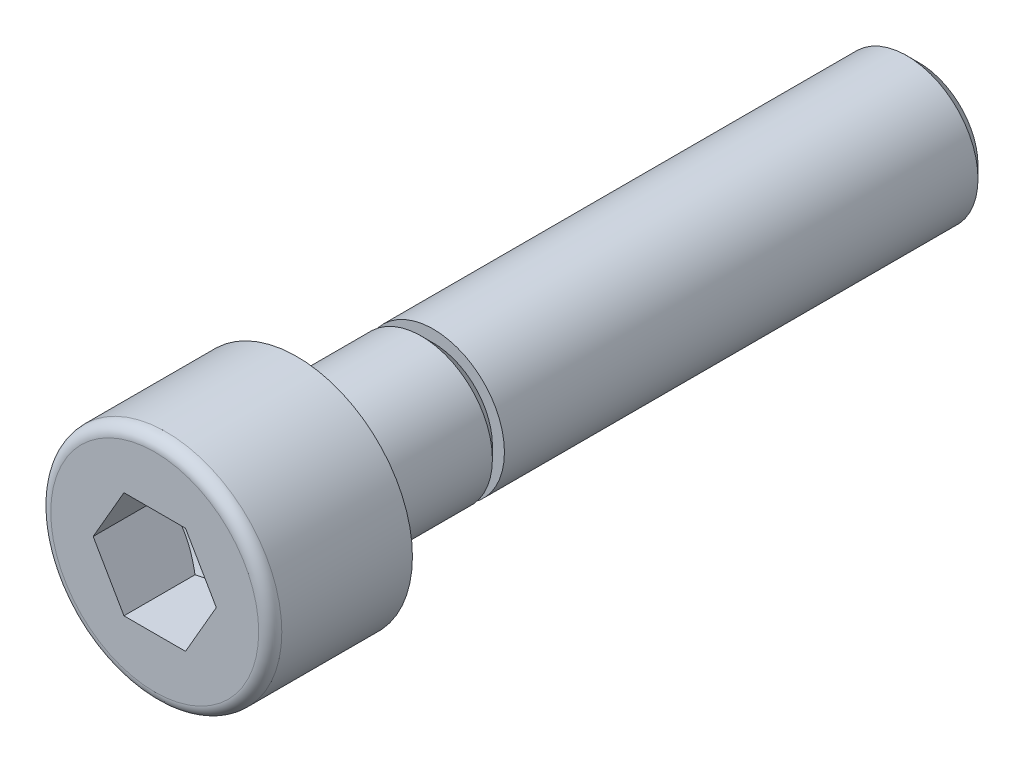
ISO-10303-21;
HEADER;
FILE_DESCRIPTION(('STEP AP214'),'2;1');
FILE_NAME('part.step','',(''),(''),'','','');
FILE_SCHEMA(('AUTOMOTIVE_DESIGN { 1 0 10303 214 1 1 1 1 }'));
ENDSEC;
DATA;
#1=APPLICATION_CONTEXT('core data for automotive mechanical design processes');
#2=APPLICATION_PROTOCOL_DEFINITION('international standard','automotive_design',2000,#1);
#3=PRODUCT_CONTEXT('',#1,'mechanical');
#4=PRODUCT('Part','Part','',(#3));
#5=PRODUCT_RELATED_PRODUCT_CATEGORY('part','',(#4));
#6=PRODUCT_DEFINITION_FORMATION('','',#4);
#7=PRODUCT_DEFINITION_CONTEXT('part definition',#1,'design');
#8=PRODUCT_DEFINITION('design','',#6,#7);
#9=PRODUCT_DEFINITION_SHAPE('','',#8);
#10=(LENGTH_UNIT() NAMED_UNIT(*) SI_UNIT(.MILLI.,.METRE.));
#11=(NAMED_UNIT(*) PLANE_ANGLE_UNIT() SI_UNIT($,.RADIAN.));
#12=(NAMED_UNIT(*) SI_UNIT($,.STERADIAN.) SOLID_ANGLE_UNIT());
#13=UNCERTAINTY_MEASURE_WITH_UNIT(LENGTH_MEASURE(1.E-05),#10,'distance_accuracy_value','');
#14=(GEOMETRIC_REPRESENTATION_CONTEXT(3) GLOBAL_UNCERTAINTY_ASSIGNED_CONTEXT((#13)) GLOBAL_UNIT_ASSIGNED_CONTEXT((#10,
#11,#12)) REPRESENTATION_CONTEXT('',''));
#15=CARTESIAN_POINT('',(0.,0.,0.));
#16=DIRECTION('',(0.,0.,1.));
#17=DIRECTION('',(1.,0.,0.));
#18=AXIS2_PLACEMENT_3D('',#15,#16,#17);
#19=CARTESIAN_POINT('',(0.,0.,8.));
#20=DIRECTION('',(0.,0.,1.));
#21=DIRECTION('',(1.,0.,0.));
#22=AXIS2_PLACEMENT_3D('',#19,#20,#21);
#23=PLANE('',#22);
#24=CARTESIAN_POINT('',(0.,0.,8.));
#25=DIRECTION('',(0.,0.,1.));
#26=DIRECTION('',(1.,0.,0.));
#27=AXIS2_PLACEMENT_3D('',#24,#25,#26);
#28=CIRCLE('',#27,5.85);
#29=CARTESIAN_POINT('',(5.85,0.,8.));
#30=VERTEX_POINT('',#29);
#31=EDGE_CURVE('E117',#30,#30,#28,.T.);
#32=ORIENTED_EDGE('',*,*,#31,.T.);
#33=EDGE_LOOP('',(#32));
#34=FACE_BOUND('',#33,.T.);
#35=DIRECTION('',(1.,0.,0.));
#36=VECTOR('',#35,1.);
#37=CARTESIAN_POINT('',(-1.73205,2.99999860124967,8.));
#38=LINE('',#37,#36);
#39=CARTESIAN_POINT('',(-1.73205,2.99999860124967,8.));
#40=VERTEX_POINT('',#39);
#41=CARTESIAN_POINT('',(1.73205,2.99999860124967,8.));
#42=VERTEX_POINT('',#41);
#43=EDGE_CURVE('E94',#40,#42,#38,.T.);
#44=ORIENTED_EDGE('',*,*,#43,.T.);
#45=DIRECTION('',(0.5,-0.866025403784438,0.));
#46=VECTOR('',#45,1.);
#47=CARTESIAN_POINT('',(1.73205,2.99999860124967,8.));
#48=LINE('',#47,#46);
#49=CARTESIAN_POINT('',(3.4641,0.,8.));
#50=VERTEX_POINT('',#49);
#51=EDGE_CURVE('E31',#42,#50,#48,.T.);
#52=ORIENTED_EDGE('',*,*,#51,.T.);
#53=DIRECTION('',(-0.5,-0.866025403784439,0.));
#54=VECTOR('',#53,1.);
#55=CARTESIAN_POINT('',(3.4641,0.,8.));
#56=LINE('',#55,#54);
#57=CARTESIAN_POINT('',(1.73205,-2.99999860124967,8.));
#58=VERTEX_POINT('',#57);
#59=EDGE_CURVE('E393',#50,#58,#56,.T.);
#60=ORIENTED_EDGE('',*,*,#59,.T.);
#61=DIRECTION('',(-1.,0.,0.));
#62=VECTOR('',#61,1.);
#63=CARTESIAN_POINT('',(1.73205,-2.99999860124967,8.));
#64=LINE('',#63,#62);
#65=CARTESIAN_POINT('',(-1.73205,-2.99999860124967,8.));
#66=VERTEX_POINT('',#65);
#67=EDGE_CURVE('E397',#58,#66,#64,.T.);
#68=ORIENTED_EDGE('',*,*,#67,.T.);
#69=DIRECTION('',(-0.5,0.866025403784439,0.));
#70=VECTOR('',#69,1.);
#71=CARTESIAN_POINT('',(-1.73205,-2.99999860124967,8.));
#72=LINE('',#71,#70);
#73=CARTESIAN_POINT('',(-3.4641,0.,8.));
#74=VERTEX_POINT('',#73);
#75=EDGE_CURVE('E402',#66,#74,#72,.T.);
#76=ORIENTED_EDGE('',*,*,#75,.T.);
#77=DIRECTION('',(0.5,0.866025403784439,0.));
#78=VECTOR('',#77,1.);
#79=CARTESIAN_POINT('',(-3.4641,0.,8.));
#80=LINE('',#79,#78);
#81=EDGE_CURVE('E103',#74,#40,#80,.T.);
#82=ORIENTED_EDGE('',*,*,#81,.T.);
#83=EDGE_LOOP('',(#44,#52,#60,#68,#76,#82));
#84=FACE_BOUND('',#83,.T.);
#85=ADVANCED_FACE('F15',(#34,#84),#23,.T.);
#86=CARTESIAN_POINT('',(0.,3.3234375,-35.));
#87=DIRECTION('',(0.,0.,-1.));
#88=DIRECTION('',(-1.,0.,0.));
#89=AXIS2_PLACEMENT_3D('',#86,#87,#88);
#90=PLANE('',#89);
#91=CARTESIAN_POINT('',(0.,0.,-35.));
#92=DIRECTION('',(0.,0.,1.));
#93=DIRECTION('',(1.,0.,0.));
#94=AXIS2_PLACEMENT_3D('',#91,#92,#93);
#95=CIRCLE('',#94,3.3234375);
#96=CARTESIAN_POINT('',(3.3234375,0.,-35.));
#97=VERTEX_POINT('',#96);
#98=EDGE_CURVE('E10',#97,#97,#95,.T.);
#99=ORIENTED_EDGE('',*,*,#98,.F.);
#100=EDGE_LOOP('',(#99));
#101=FACE_BOUND('',#100,.T.);
#102=ADVANCED_FACE('F17',(#101),#90,.T.);
#103=CARTESIAN_POINT('',(0.,0.,-34.3234375));
#104=DIRECTION('',(0.,0.,1.));
#105=DIRECTION('',(1.,0.,0.));
#106=AXIS2_PLACEMENT_3D('',#103,#104,#105);
#107=CONICAL_SURFACE('',#106,4.,0.78539816339745);
#108=ORIENTED_EDGE('',*,*,#98,.T.);
#109=EDGE_LOOP('',(#108));
#110=FACE_BOUND('',#109,.T.);
#111=CARTESIAN_POINT('',(0.,0.,-34.3234375));
#112=DIRECTION('',(0.,0.,1.));
#113=DIRECTION('',(1.,0.,0.));
#114=AXIS2_PLACEMENT_3D('',#111,#112,#113);
#115=CIRCLE('',#114,4.);
#116=CARTESIAN_POINT('',(4.,0.,-34.3234375));
#117=VERTEX_POINT('',#116);
#118=EDGE_CURVE('E24',#117,#117,#115,.T.);
#119=ORIENTED_EDGE('',*,*,#118,.F.);
#120=EDGE_LOOP('',(#119));
#121=FACE_BOUND('',#120,.T.);
#122=ADVANCED_FACE('F158',(#110,#121),#107,.T.);
#123=CARTESIAN_POINT('',(0.,0.,8.));
#124=DIRECTION('',(0.,0.,1.));
#125=DIRECTION('',(1.,0.,0.));
#126=AXIS2_PLACEMENT_3D('',#123,#124,#125);
#127=CYLINDRICAL_SURFACE('',#126,4.);
#128=ORIENTED_EDGE('',*,*,#118,.T.);
#129=EDGE_LOOP('',(#128));
#130=FACE_BOUND('',#129,.T.);
#131=CARTESIAN_POINT('',(0.,0.,-7.6765625));
#132=DIRECTION('',(0.,0.,1.));
#133=DIRECTION('',(1.,0.,0.));
#134=AXIS2_PLACEMENT_3D('',#131,#132,#133);
#135=CIRCLE('',#134,4.);
#136=CARTESIAN_POINT('',(4.,0.,-7.6765625));
#137=VERTEX_POINT('',#136);
#138=EDGE_CURVE('E145',#137,#137,#135,.T.);
#139=ORIENTED_EDGE('',*,*,#138,.F.);
#140=EDGE_LOOP('',(#139));
#141=FACE_BOUND('',#140,.T.);
#142=ADVANCED_FACE('F155',(#130,#141),#127,.T.);
#143=CARTESIAN_POINT('',(0.,3.3234375,-7.6765625));
#144=DIRECTION('',(0.,0.,1.));
#145=DIRECTION('',(1.,0.,0.));
#146=AXIS2_PLACEMENT_3D('',#143,#144,#145);
#147=PLANE('',#146);
#148=ORIENTED_EDGE('',*,*,#138,.T.);
#149=EDGE_LOOP('',(#148));
#150=FACE_BOUND('',#149,.T.);
#151=CARTESIAN_POINT('',(0.,0.,-7.6765625));
#152=DIRECTION('',(0.,0.,1.));
#153=DIRECTION('',(1.,0.,0.));
#154=AXIS2_PLACEMENT_3D('',#151,#152,#153);
#155=CIRCLE('',#154,3.3234375);
#156=CARTESIAN_POINT('',(3.3234375,0.,-7.6765625));
#157=VERTEX_POINT('',#156);
#158=EDGE_CURVE('E141',#157,#157,#155,.T.);
#159=ORIENTED_EDGE('',*,*,#158,.F.);
#160=EDGE_LOOP('',(#159));
#161=FACE_BOUND('',#160,.T.);
#162=ADVANCED_FACE('F166',(#150,#161),#147,.T.);
#163=CARTESIAN_POINT('',(0.,0.,-7.));
#164=DIRECTION('',(0.,0.,1.));
#165=DIRECTION('',(1.,0.,0.));
#166=AXIS2_PLACEMENT_3D('',#163,#164,#165);
#167=CONICAL_SURFACE('',#166,4.,0.785398163397449);
#168=ORIENTED_EDGE('',*,*,#158,.T.);
#169=EDGE_LOOP('',(#168));
#170=FACE_BOUND('',#169,.T.);
#171=CARTESIAN_POINT('',(0.,0.,-7.));
#172=DIRECTION('',(0.,0.,1.));
#173=DIRECTION('',(1.,0.,0.));
#174=AXIS2_PLACEMENT_3D('',#171,#172,#173);
#175=CIRCLE('',#174,4.);
#176=CARTESIAN_POINT('',(4.,0.,-7.));
#177=VERTEX_POINT('',#176);
#178=EDGE_CURVE('E137',#177,#177,#175,.T.);
#179=ORIENTED_EDGE('',*,*,#178,.F.);
#180=EDGE_LOOP('',(#179));
#181=FACE_BOUND('',#180,.T.);
#182=ADVANCED_FACE('F198',(#170,#181),#167,.T.);
#183=CARTESIAN_POINT('',(0.,0.,8.));
#184=DIRECTION('',(0.,0.,1.));
#185=DIRECTION('',(1.,0.,0.));
#186=AXIS2_PLACEMENT_3D('',#183,#184,#185);
#187=CYLINDRICAL_SURFACE('',#186,4.);
#188=ORIENTED_EDGE('',*,*,#178,.T.);
#189=EDGE_LOOP('',(#188));
#190=FACE_BOUND('',#189,.T.);
#191=CARTESIAN_POINT('',(0.,0.,-0.4));
#192=DIRECTION('',(0.,0.,1.));
#193=DIRECTION('',(1.,0.,0.));
#194=AXIS2_PLACEMENT_3D('',#191,#192,#193);
#195=CIRCLE('',#194,4.);
#196=CARTESIAN_POINT('',(4.,0.,-0.4));
#197=VERTEX_POINT('',#196);
#198=EDGE_CURVE('E133',#197,#197,#195,.T.);
#199=ORIENTED_EDGE('',*,*,#198,.F.);
#200=EDGE_LOOP('',(#199));
#201=FACE_BOUND('',#200,.T.);
#202=ADVANCED_FACE('F194',(#190,#201),#187,.T.);
#203=CARTESIAN_POINT('',(0.,0.,-0.4));
#204=DIRECTION('',(0.,0.,1.));
#205=DIRECTION('',(1.,0.,0.));
#206=AXIS2_PLACEMENT_3D('',#203,#204,#205);
#207=TOROIDAL_SURFACE('',#206,4.4,0.4);
#208=ORIENTED_EDGE('',*,*,#198,.T.);
#209=EDGE_LOOP('',(#208));
#210=FACE_BOUND('',#209,.T.);
#211=CARTESIAN_POINT('',(0.,0.,0.));
#212=DIRECTION('',(0.,0.,1.));
#213=DIRECTION('',(1.,0.,0.));
#214=AXIS2_PLACEMENT_3D('',#211,#212,#213);
#215=CIRCLE('',#214,4.4);
#216=CARTESIAN_POINT('',(4.4,0.,0.));
#217=VERTEX_POINT('',#216);
#218=EDGE_CURVE('E129',#217,#217,#215,.T.);
#219=ORIENTED_EDGE('',*,*,#218,.F.);
#220=EDGE_LOOP('',(#219));
#221=FACE_BOUND('',#220,.T.);
#222=ADVANCED_FACE('F190',(#210,#221),#207,.F.);
#223=CARTESIAN_POINT('',(0.,6.5,0.));
#224=DIRECTION('',(0.,0.,-1.));
#225=DIRECTION('',(-1.,0.,0.));
#226=AXIS2_PLACEMENT_3D('',#223,#224,#225);
#227=PLANE('',#226);
#228=ORIENTED_EDGE('',*,*,#218,.T.);
#229=EDGE_LOOP('',(#228));
#230=FACE_BOUND('',#229,.T.);
#231=CARTESIAN_POINT('',(0.,0.,0.));
#232=DIRECTION('',(0.,0.,1.));
#233=DIRECTION('',(1.,0.,0.));
#234=AXIS2_PLACEMENT_3D('',#231,#232,#233);
#235=CIRCLE('',#234,6.5);
#236=CARTESIAN_POINT('',(6.5,0.,0.));
#237=VERTEX_POINT('',#236);
#238=EDGE_CURVE('E125',#237,#237,#235,.T.);
#239=ORIENTED_EDGE('',*,*,#238,.F.);
#240=EDGE_LOOP('',(#239));
#241=FACE_BOUND('',#240,.T.);
#242=ADVANCED_FACE('F186',(#230,#241),#227,.T.);
#243=CARTESIAN_POINT('',(0.,0.,8.));
#244=DIRECTION('',(0.,0.,1.));
#245=DIRECTION('',(1.,0.,0.));
#246=AXIS2_PLACEMENT_3D('',#243,#244,#245);
#247=CYLINDRICAL_SURFACE('',#246,6.5);
#248=ORIENTED_EDGE('',*,*,#238,.T.);
#249=EDGE_LOOP('',(#248));
#250=FACE_BOUND('',#249,.T.);
#251=CARTESIAN_POINT('',(0.,0.,7.35));
#252=DIRECTION('',(0.,0.,1.));
#253=DIRECTION('',(1.,0.,0.));
#254=AXIS2_PLACEMENT_3D('',#251,#252,#253);
#255=CIRCLE('',#254,6.5);
#256=CARTESIAN_POINT('',(6.5,0.,7.35));
#257=VERTEX_POINT('',#256);
#258=EDGE_CURVE('E121',#257,#257,#255,.T.);
#259=ORIENTED_EDGE('',*,*,#258,.F.);
#260=EDGE_LOOP('',(#259));
#261=FACE_BOUND('',#260,.T.);
#262=ADVANCED_FACE('F182',(#250,#261),#247,.T.);
#263=CARTESIAN_POINT('',(0.,0.,7.35));
#264=DIRECTION('',(0.,0.,1.));
#265=DIRECTION('',(1.,0.,0.));
#266=AXIS2_PLACEMENT_3D('',#263,#264,#265);
#267=TOROIDAL_SURFACE('',#266,5.85,0.65);
#268=ORIENTED_EDGE('',*,*,#31,.F.);
#269=EDGE_LOOP('',(#268));
#270=FACE_BOUND('',#269,.T.);
#271=ORIENTED_EDGE('',*,*,#258,.T.);
#272=EDGE_LOOP('',(#271));
#273=FACE_BOUND('',#272,.T.);
#274=ADVANCED_FACE('F179',(#270,#273),#267,.T.);
#275=CARTESIAN_POINT('',(1.73205,2.99999860124967,2.00000093250022));
#276=DIRECTION('',(-0.866025403784438,-0.5,0.));
#277=DIRECTION('',(-0.5,0.866025403784438,0.));
#278=AXIS2_PLACEMENT_3D('',#275,#276,#277);
#279=PLANE('',#278);
#280=DIRECTION('',(0.,0.,1.));
#281=VECTOR('',#280,1.);
#282=CARTESIAN_POINT('',(3.4641,0.,2.00000093250022));
#283=LINE('',#282,#281);
#284=CARTESIAN_POINT('',(3.4641,0.,4.));
#285=VERTEX_POINT('',#284);
#286=EDGE_CURVE('E115',#285,#50,#283,.T.);
#287=ORIENTED_EDGE('',*,*,#286,.T.);
#288=ORIENTED_EDGE('',*,*,#51,.F.);
#289=DIRECTION('',(0.,0.,1.));
#290=VECTOR('',#289,1.);
#291=CARTESIAN_POINT('',(1.73205,2.99999860124967,2.00000093250022));
#292=LINE('',#291,#290);
#293=CARTESIAN_POINT('',(1.73205,2.99999860124967,4.));
#294=VERTEX_POINT('',#293);
#295=EDGE_CURVE('E87',#294,#42,#292,.T.);
#296=ORIENTED_EDGE('',*,*,#295,.F.);
#297=CARTESIAN_POINT('',(3.46410115470054,-2.E-06,4.000000666667));
#298=CARTESIAN_POINT('',(3.38798802738784,0.13182980362855,3.95604395009466));
#299=CARTESIAN_POINT('',(3.3112178926859,0.264799577436221,3.91606760853224));
#300=CARTESIAN_POINT('',(3.15634839816405,0.533041410490572,3.84629008580233));
#301=CARTESIAN_POINT('',(3.07824628749693,0.668318234344403,3.81651358661626));
#302=CARTESIAN_POINT('',(2.92300994705344,0.937195463173583,3.77016429262893));
#303=CARTESIAN_POINT('',(2.84589959576637,1.07075450939227,3.75328298206562));
#304=CARTESIAN_POINT('',(2.69131625051731,1.33850071736759,3.73313394356686));
#305=CARTESIAN_POINT('',(2.61384381804288,1.47268690659927,3.72984952653052));
#306=CARTESIAN_POINT('',(2.46909473680878,1.72339966964563,3.73669947700851));
#307=CARTESIAN_POINT('',(2.40179636790158,1.83996386385941,3.7451519545752));
#308=CARTESIAN_POINT('',(2.26763805726736,2.0723328741355,3.77193599540531));
#309=CARTESIAN_POINT('',(2.20077857921606,2.18813688708789,3.79027669919885));
#310=CARTESIAN_POINT('',(2.06634388703742,2.42098460424117,3.83612493449532));
#311=CARTESIAN_POINT('',(1.99878567895881,2.53799885310164,3.86382672410573));
#312=CARTESIAN_POINT('',(1.86467660536975,2.77028258231389,3.92669808503149));
#313=CARTESIAN_POINT('',(1.7981240230759,2.88555503622174,3.96185289344307));
#314=CARTESIAN_POINT('',(1.73204884529946,3.00000060124967,4.000000666667));
#315=B_SPLINE_CURVE_WITH_KNOTS('',3,(#297,#298,#299,#300,#301,#302,#303,#304,#305,#306,#307,
#308,#309,#310,#311,#312,#313,#314),.UNSPECIFIED.,.F.,.F.,(4,2,2,2,2,2,2,2,4),(0.,
0.475523953742489,0.952190602152414,1.41706121210608,1.88136106102899,2.28556223517509,
2.69013768914087,3.10368471949223,3.51642012606278),.UNSPECIFIED.);
#316=EDGE_CURVE('E79',#285,#294,#315,.T.);
#317=ORIENTED_EDGE('',*,*,#316,.F.);
#318=EDGE_LOOP('',(#287,#288,#296,#317));
#319=FACE_BOUND('',#318,.T.);
#320=ADVANCED_FACE('F88',(#319),#279,.T.);
#321=CARTESIAN_POINT('',(3.4641,0.,2.00000093250022));
#322=DIRECTION('',(-0.866025403784439,0.5,0.));
#323=DIRECTION('',(0.5,0.866025403784439,0.));
#324=AXIS2_PLACEMENT_3D('',#321,#322,#323);
#325=PLANE('',#324);
#326=DIRECTION('',(0.,0.,1.));
#327=VECTOR('',#326,1.);
#328=CARTESIAN_POINT('',(1.73205,-2.99999860124967,2.00000093250022));
#329=LINE('',#328,#327);
#330=CARTESIAN_POINT('',(1.73205,-2.99999860124967,4.));
#331=VERTEX_POINT('',#330);
#332=EDGE_CURVE('E112',#331,#58,#329,.T.);
#333=ORIENTED_EDGE('',*,*,#332,.T.);
#334=ORIENTED_EDGE('',*,*,#59,.F.);
#335=ORIENTED_EDGE('',*,*,#286,.F.);
#336=CARTESIAN_POINT('',(1.73204884529946,-3.00000060124967,4.000000666667));
#337=CARTESIAN_POINT('',(1.80816197261216,-2.86816879762113,3.95604395009466));
#338=CARTESIAN_POINT('',(1.8849321073141,-2.73519902381345,3.91606760853224));
#339=CARTESIAN_POINT('',(2.03980160183595,-2.4669571907591,3.84629008580233));
#340=CARTESIAN_POINT('',(2.11790371250308,-2.33168036690527,3.81651358661626));
#341=CARTESIAN_POINT('',(2.27314005294657,-2.06280313807609,3.77016429262893));
#342=CARTESIAN_POINT('',(2.35025040423364,-1.9292440918574,3.75328298206562));
#343=CARTESIAN_POINT('',(2.50483374948269,-1.66149788388208,3.73313394356686));
#344=CARTESIAN_POINT('',(2.58230618195712,-1.52731169465041,3.72984952653052));
#345=CARTESIAN_POINT('',(2.72705526319122,-1.27659893160404,3.73669947700851));
#346=CARTESIAN_POINT('',(2.79435363209842,-1.16003473739026,3.7451519545752));
#347=CARTESIAN_POINT('',(2.92851194273264,-0.927665727114178,3.77193599540531));
#348=CARTESIAN_POINT('',(2.99537142078394,-0.811861714161788,3.79027669919885));
#349=CARTESIAN_POINT('',(3.12980611296258,-0.579013997008506,3.83612493449532));
#350=CARTESIAN_POINT('',(3.19736432104119,-0.461999748148031,3.86382672410573));
#351=CARTESIAN_POINT('',(3.33147339463025,-0.229716018935787,3.92669808503149));
#352=CARTESIAN_POINT('',(3.3980259769241,-0.114443565027938,3.96185289344307));
#353=CARTESIAN_POINT('',(3.46410115470054,2.00000000016455E-06,4.000000666667));
#354=B_SPLINE_CURVE_WITH_KNOTS('',3,(#336,#337,#338,#339,#340,#341,#342,#343,#344,#345,#346,
#347,#348,#349,#350,#351,#352,#353),.UNSPECIFIED.,.F.,.F.,(4,2,2,2,2,2,2,2,4),(0.,
0.475523953742489,0.952190602152415,1.41706121210608,1.88136106102899,2.28556223517509,
2.69013768914087,3.10368471949224,3.51642012606278),.UNSPECIFIED.);
#355=EDGE_CURVE('E83',#331,#285,#354,.T.);
#356=ORIENTED_EDGE('',*,*,#355,.F.);
#357=EDGE_LOOP('',(#333,#334,#335,#356));
#358=FACE_BOUND('',#357,.T.);
#359=ADVANCED_FACE('F255',(#358),#325,.T.);
#360=CARTESIAN_POINT('',(1.73205,-2.99999860124967,2.00000093250022));
#361=DIRECTION('',(0.,1.,0.));
#362=DIRECTION('',(1.,0.,0.));
#363=AXIS2_PLACEMENT_3D('',#360,#361,#362);
#364=PLANE('',#363);
#365=DIRECTION('',(0.,0.,1.));
#366=VECTOR('',#365,1.);
#367=CARTESIAN_POINT('',(-1.73205,-2.99999860124967,2.00000093250022));
#368=LINE('',#367,#366);
#369=CARTESIAN_POINT('',(-1.73205,-2.99999860124967,4.));
#370=VERTEX_POINT('',#369);
#371=EDGE_CURVE('E109',#370,#66,#368,.T.);
#372=ORIENTED_EDGE('',*,*,#371,.T.);
#373=ORIENTED_EDGE('',*,*,#67,.F.);
#374=ORIENTED_EDGE('',*,*,#332,.F.);
#375=CARTESIAN_POINT('',(-4.48543327457975,-2.99999860124967,5.11550534688789));
#376=CARTESIAN_POINT('',(-4.35588300182045,-2.99999860124968,5.05335202823086));
#377=CARTESIAN_POINT('',(-4.22601712689906,-2.99999860124968,4.99184428363088));
#378=CARTESIAN_POINT('',(-3.96548596949491,-2.99999860124968,4.87048616792012));
#379=CARTESIAN_POINT('',(-3.8348205482707,-2.99999860124968,4.81063609502289));
#380=CARTESIAN_POINT('',(-3.57177288863851,-2.99999860124968,4.69262519015416));
#381=CARTESIAN_POINT('',(-3.43938504402405,-2.99999860124968,4.63447680747079));
#382=CARTESIAN_POINT('',(-3.17349843851354,-2.99999860124968,4.52078755920262));
#383=CARTESIAN_POINT('',(-3.03999973576996,-2.99999860124968,4.46524655812208));
#384=CARTESIAN_POINT('',(-2.768162463709,-2.99999860124968,4.356052088226));
#385=CARTESIAN_POINT('',(-2.6297886121049,-2.99999860124968,4.30248593799558));
#386=CARTESIAN_POINT('',(-2.35136718484087,-2.99999860124968,4.19980717710758));
#387=CARTESIAN_POINT('',(-2.21131941732441,-2.99999860124968,4.15069508260204));
#388=CARTESIAN_POINT('',(-1.92964461201453,-2.99999860124968,4.0583268362776));
#389=CARTESIAN_POINT('',(-1.78802198151526,-2.99999860124968,4.01505738929466));
#390=CARTESIAN_POINT('',(-1.5027595178787,-2.99999860124968,3.93586037360709));
#391=CARTESIAN_POINT('',(-1.35912038012664,-2.99999860124967,3.89993033732045));
#392=CARTESIAN_POINT('',(-1.07010555070962,-2.99999860124967,3.83732117927408));
#393=CARTESIAN_POINT('',(-0.924733968226053,-2.99999860124968,3.81062345741575));
#394=CARTESIAN_POINT('',(-0.632364406890453,-2.99999860124968,3.76822932963637));
#395=CARTESIAN_POINT('',(-0.485366538627767,-2.99999860124968,3.75253218027772));
#396=CARTESIAN_POINT('',(-0.192319587588578,-2.99999860124968,3.73359558572512));
#397=CARTESIAN_POINT('',(-0.0462802395775282,-2.99999860124968,3.7302091312114));
#398=CARTESIAN_POINT('',(0.245570179657408,-2.99999860124967,3.73580306799417));
#399=CARTESIAN_POINT('',(0.391381236186774,-2.99999860124967,3.74478422504342));
#400=CARTESIAN_POINT('',(0.643868801818134,-2.99999860124967,3.77043931929728));
#401=CARTESIAN_POINT('',(0.750824417337119,-2.99999860124968,3.78449289385632));
#402=CARTESIAN_POINT('',(0.963839823399503,-2.99999860124968,3.81828752344997));
#403=CARTESIAN_POINT('',(1.06989946726334,-2.99999860124967,3.83802949184569));
#404=CARTESIAN_POINT('',(1.3866523174391,-2.99999860124967,3.90473774725038));
#405=CARTESIAN_POINT('',(1.59578448976093,-2.99999860124967,3.95917098002028));
#406=CARTESIAN_POINT('',(1.90847464693118,-2.99999860124967,4.05215904385339));
#407=CARTESIAN_POINT('',(2.01368123453312,-2.99999860124967,4.08547388349457));
#408=CARTESIAN_POINT('',(2.2230712785146,-2.99999860124967,4.15520553297478));
#409=CARTESIAN_POINT('',(2.32725472754368,-2.99999860124967,4.19162236508109));
#410=CARTESIAN_POINT('',(2.5346401381415,-2.99999860124967,4.26700365578984));
#411=CARTESIAN_POINT('',(2.63784247736153,-2.99999860124967,4.30596708456284));
#412=CARTESIAN_POINT('',(2.84341531632341,-2.99999860124967,4.38601920177049));
#413=CARTESIAN_POINT('',(2.94578582975323,-2.99999860124967,4.42710785515155));
#414=CARTESIAN_POINT('',(3.20709884294595,-2.99999860124967,4.53462485808349));
#415=CARTESIAN_POINT('',(3.36551842876432,-2.99999860124967,4.60232247798653));
#416=CARTESIAN_POINT('',(3.68093034594112,-2.99999860124967,4.74097446174301));
#417=CARTESIAN_POINT('',(3.83792256969104,-2.99999860124967,4.81192906874051));
#418=CARTESIAN_POINT('',(4.15078503766652,-2.99999860124967,4.95636011182018));
#419=CARTESIAN_POINT('',(4.30665500466942,-2.99999860124967,5.02983714677853));
#420=CARTESIAN_POINT('',(4.61745618143545,-2.99999860124967,5.17875357810155));
#421=CARTESIAN_POINT('',(4.77238737022452,-2.99999860124967,5.25419301811218));
#422=CARTESIAN_POINT('',(5.23640418793105,-2.99999860124967,5.48299928695644));
#423=CARTESIAN_POINT('',(5.54434659711443,-2.99999860124967,5.63868235171446));
#424=CARTESIAN_POINT('',(6.15811770750441,-2.99999860124967,5.95402735662527));
#425=CARTESIAN_POINT('',(6.46394670577914,-2.99999860124967,6.11368872242025));
#426=CARTESIAN_POINT('',(7.04534872843614,-2.99999860124967,6.42057520044777));
#427=CARTESIAN_POINT('',(7.32105311281734,-2.99999860124967,6.5675518484252));
#428=CARTESIAN_POINT('',(7.8715766031856,-2.99999860124967,6.86317929411155));
#429=CARTESIAN_POINT('',(8.14639567098826,-2.99999860124967,7.01183016281988));
#430=CARTESIAN_POINT('',(8.69465235354485,-2.99999860124967,7.31000721537446));
#431=CARTESIAN_POINT('',(8.96809170411181,-2.99999860124967,7.45953021113162));
#432=CARTESIAN_POINT('',(9.51441609704977,-2.99999860124967,7.75954857707938));
#433=CARTESIAN_POINT('',(9.7873011705121,-2.99999860124967,7.9100438906319));
#434=CARTESIAN_POINT('',(10.0599876463514,-2.99999860124967,8.06089588985436));
#435=B_SPLINE_CURVE_WITH_KNOTS('',3,(#375,#376,#377,#378,#379,#380,#381,#382,#383,#384,#385,
#386,#387,#388,#389,#390,#391,#392,#393,#394,#395,#396,#397,#398,#399,#400,#401,#402,#403,#404,
#405,#406,#407,#408,#409,#410,#411,#412,#413,#414,#415,#416,#417,#418,#419,#420,#421,#422,#423,
#424,#425,#426,#427,#428,#429,#430,#431,#432,#433,#434),.UNSPECIFIED.,.F.,.F.,(4,2,2,2,2,2,2,2,
2,2,2,2,2,2,2,2,2,2,2,2,2,2,2,2,2,2,2,2,2,4),(0.,0.431070825268884,0.862218702592447,
1.29598193866484,1.72972260869926,2.1748037354424,2.6199363740623,3.06403838356741,
3.50799083496353,3.95104358384073,4.39406638756309,4.83178108559632,5.26952288638151,
5.59298785731552,5.91650479460928,6.56394435551607,6.89498708790627,7.22603219684761,
7.55694425154326,7.88785084989221,8.40463219430166,8.92145218096412,9.43839573164984,
9.9553507895523,10.9904747643594,12.0254501517116,12.9627445166865,13.9000787807063,
14.8350289095967,15.7699250594719),.UNSPECIFIED.);
#436=EDGE_CURVE('E439',#370,#331,#435,.T.);
#437=ORIENTED_EDGE('',*,*,#436,.F.);
#438=EDGE_LOOP('',(#372,#373,#374,#437));
#439=FACE_BOUND('',#438,.T.);
#440=ADVANCED_FACE('F261',(#439),#364,.T.);
#441=CARTESIAN_POINT('',(-1.73205,-2.99999860124967,2.00000093250022));
#442=DIRECTION('',(0.866025403784439,0.5,0.));
#443=DIRECTION('',(0.5,-0.866025403784439,0.));
#444=AXIS2_PLACEMENT_3D('',#441,#442,#443);
#445=PLANE('',#444);
#446=DIRECTION('',(0.,0.,1.));
#447=VECTOR('',#446,1.);
#448=CARTESIAN_POINT('',(-3.4641,0.,2.00000093250022));
#449=LINE('',#448,#447);
#450=CARTESIAN_POINT('',(-3.4641,0.,4.));
#451=VERTEX_POINT('',#450);
#452=EDGE_CURVE('E100',#451,#74,#449,.T.);
#453=ORIENTED_EDGE('',*,*,#452,.T.);
#454=ORIENTED_EDGE('',*,*,#75,.F.);
#455=ORIENTED_EDGE('',*,*,#371,.F.);
#456=CARTESIAN_POINT('',(-3.46410115470054,1.99999999888977E-06,4.000000666667));
#457=CARTESIAN_POINT('',(-3.38798802738784,-0.131829803628551,3.95604395009466));
#458=CARTESIAN_POINT('',(-3.3112178926859,-0.264799577436221,3.91606760853224));
#459=CARTESIAN_POINT('',(-3.15634839816405,-0.533041410490573,3.84629008580233));
#460=CARTESIAN_POINT('',(-3.07824628749692,-0.668318234344405,3.81651358661626));
#461=CARTESIAN_POINT('',(-2.92300994705343,-0.937195463173585,3.77016429262893));
#462=CARTESIAN_POINT('',(-2.84589959576636,-1.07075450939228,3.75328298206562));
#463=CARTESIAN_POINT('',(-2.69131625051731,-1.33850071736759,3.73313394356686));
#464=CARTESIAN_POINT('',(-2.61384381804288,-1.47268690659927,3.72984952653052));
#465=CARTESIAN_POINT('',(-2.46909473680878,-1.72339966964564,3.73669947700851));
#466=CARTESIAN_POINT('',(-2.40179636790158,-1.83996386385942,3.7451519545752));
#467=CARTESIAN_POINT('',(-2.26763805726736,-2.0723328741355,3.77193599540531));
#468=CARTESIAN_POINT('',(-2.20077857921606,-2.18813688708789,3.79027669919885));
#469=CARTESIAN_POINT('',(-2.06634388703742,-2.42098460424117,3.83612493449532));
#470=CARTESIAN_POINT('',(-1.99878567895881,-2.53799885310164,3.86382672410573));
#471=CARTESIAN_POINT('',(-1.86467660536975,-2.77028258231389,3.92669808503149));
#472=CARTESIAN_POINT('',(-1.7981240230759,-2.88555503622174,3.96185289344307));
#473=CARTESIAN_POINT('',(-1.73204884529946,-3.00000060124967,4.000000666667));
#474=B_SPLINE_CURVE_WITH_KNOTS('',3,(#456,#457,#458,#459,#460,#461,#462,#463,#464,#465,#466,
#467,#468,#469,#470,#471,#472,#473),.UNSPECIFIED.,.F.,.F.,(4,2,2,2,2,2,2,2,4),(0.,
0.47552395374249,0.952190602152416,1.41706121210608,1.88136106102899,2.28556223517509,
2.69013768914087,3.10368471949223,3.51642012606278),.UNSPECIFIED.);
#475=EDGE_CURVE('E435',#451,#370,#474,.T.);
#476=ORIENTED_EDGE('',*,*,#475,.F.);
#477=EDGE_LOOP('',(#453,#454,#455,#476));
#478=FACE_BOUND('',#477,.T.);
#479=ADVANCED_FACE('F268',(#478),#445,.T.);
#480=CARTESIAN_POINT('',(-3.4641,0.,2.00000093250022));
#481=DIRECTION('',(0.866025403784439,-0.5,0.));
#482=DIRECTION('',(-0.5,-0.866025403784439,0.));
#483=AXIS2_PLACEMENT_3D('',#480,#481,#482);
#484=PLANE('',#483);
#485=DIRECTION('',(0.,0.,1.));
#486=VECTOR('',#485,1.);
#487=CARTESIAN_POINT('',(-1.73205,2.99999860124967,2.00000093250022));
#488=LINE('',#487,#486);
#489=CARTESIAN_POINT('',(-1.73205,2.99999860124967,4.));
#490=VERTEX_POINT('',#489);
#491=EDGE_CURVE('E93',#490,#40,#488,.T.);
#492=ORIENTED_EDGE('',*,*,#491,.T.);
#493=ORIENTED_EDGE('',*,*,#81,.F.);
#494=ORIENTED_EDGE('',*,*,#452,.F.);
#495=CARTESIAN_POINT('',(-1.73204884529947,3.00000060124967,4.000000666667));
#496=CARTESIAN_POINT('',(-1.80816197261216,2.86816879762112,3.95604395009466));
#497=CARTESIAN_POINT('',(-1.8849321073141,2.73519902381345,3.91606760853224));
#498=CARTESIAN_POINT('',(-2.03980160183595,2.4669571907591,3.84629008580233));
#499=CARTESIAN_POINT('',(-2.11790371250308,2.33168036690527,3.81651358661626));
#500=CARTESIAN_POINT('',(-2.27314005294657,2.06280313807609,3.77016429262893));
#501=CARTESIAN_POINT('',(-2.35025040423364,1.9292440918574,3.75328298206562));
#502=CARTESIAN_POINT('',(-2.50483374948269,1.66149788388208,3.73313394356686));
#503=CARTESIAN_POINT('',(-2.58230618195713,1.52731169465041,3.72984952653052));
#504=CARTESIAN_POINT('',(-2.72705526319122,1.27659893160404,3.73669947700851));
#505=CARTESIAN_POINT('',(-2.79435363209842,1.16003473739026,3.7451519545752));
#506=CARTESIAN_POINT('',(-2.92851194273264,0.927665727114175,3.77193599540531));
#507=CARTESIAN_POINT('',(-2.99537142078394,0.811861714161786,3.79027669919885));
#508=CARTESIAN_POINT('',(-3.12980611296258,0.579013997008505,3.83612493449532));
#509=CARTESIAN_POINT('',(-3.1973643210412,0.46199974814803,3.86382672410573));
#510=CARTESIAN_POINT('',(-3.33147339463025,0.229716018935787,3.92669808503149));
#511=CARTESIAN_POINT('',(-3.3980259769241,0.114443565027938,3.96185289344307));
#512=CARTESIAN_POINT('',(-3.46410115470054,-2.00000000064275E-06,4.000000666667));
#513=B_SPLINE_CURVE_WITH_KNOTS('',3,(#495,#496,#497,#498,#499,#500,#501,#502,#503,#504,#505,
#506,#507,#508,#509,#510,#511,#512),.UNSPECIFIED.,.F.,.F.,(4,2,2,2,2,2,2,2,4),(0.,
0.475523953742489,0.952190602152416,1.41706121210608,1.88136106102899,2.28556223517509,
2.69013768914087,3.10368471949223,3.51642012606278),.UNSPECIFIED.);
#514=EDGE_CURVE('E39',#490,#451,#513,.T.);
#515=ORIENTED_EDGE('',*,*,#514,.F.);
#516=EDGE_LOOP('',(#492,#493,#494,#515));
#517=FACE_BOUND('',#516,.T.);
#518=ADVANCED_FACE('F276',(#517),#484,.T.);
#519=CARTESIAN_POINT('',(-1.73205,2.99999860124967,2.00000093250022));
#520=DIRECTION('',(0.,-1.,0.));
#521=DIRECTION('',(-1.,0.,0.));
#522=AXIS2_PLACEMENT_3D('',#519,#520,#521);
#523=PLANE('',#522);
#524=ORIENTED_EDGE('',*,*,#295,.T.);
#525=ORIENTED_EDGE('',*,*,#43,.F.);
#526=ORIENTED_EDGE('',*,*,#491,.F.);
#527=CARTESIAN_POINT('',(-4.48543327457975,2.99999860124967,5.11550534688789));
#528=CARTESIAN_POINT('',(-4.35588300182045,2.99999860124967,5.05335202823086));
#529=CARTESIAN_POINT('',(-4.22601712689906,2.99999860124967,4.99184428363088));
#530=CARTESIAN_POINT('',(-3.9654859694949,2.99999860124967,4.87048616792012));
#531=CARTESIAN_POINT('',(-3.8348205482707,2.99999860124967,4.81063609502289));
#532=CARTESIAN_POINT('',(-3.57177288863851,2.99999860124967,4.69262519015416));
#533=CARTESIAN_POINT('',(-3.43938504402405,2.99999860124967,4.63447680747079));
#534=CARTESIAN_POINT('',(-3.17349843851354,2.99999860124967,4.52078755920262));
#535=CARTESIAN_POINT('',(-3.03999973576996,2.99999860124967,4.46524655812208));
#536=CARTESIAN_POINT('',(-2.768162463709,2.99999860124967,4.356052088226));
#537=CARTESIAN_POINT('',(-2.6297886121049,2.99999860124967,4.30248593799557));
#538=CARTESIAN_POINT('',(-2.35136718484087,2.99999860124967,4.19980717710757));
#539=CARTESIAN_POINT('',(-2.21131941732441,2.99999860124967,4.15069508260204));
#540=CARTESIAN_POINT('',(-1.92964461201453,2.99999860124967,4.0583268362776));
#541=CARTESIAN_POINT('',(-1.78802198151526,2.99999860124967,4.01505738929466));
#542=CARTESIAN_POINT('',(-1.5027595178787,2.99999860124967,3.93586037360709));
#543=CARTESIAN_POINT('',(-1.35912038012664,2.99999860124967,3.89993033732045));
#544=CARTESIAN_POINT('',(-1.07010555070962,2.99999860124967,3.83732117927408));
#545=CARTESIAN_POINT('',(-0.924733968226055,2.99999860124968,3.81062345741575));
#546=CARTESIAN_POINT('',(-0.632364406890455,2.99999860124968,3.76822932963637));
#547=CARTESIAN_POINT('',(-0.485366538627769,2.99999860124968,3.75253218027772));
#548=CARTESIAN_POINT('',(-0.19231958758858,2.99999860124968,3.73359558572512));
#549=CARTESIAN_POINT('',(-0.0462802395775301,2.99999860124968,3.7302091312114));
#550=CARTESIAN_POINT('',(0.245570179657406,2.99999860124968,3.73580306799417));
#551=CARTESIAN_POINT('',(0.391381236186772,2.99999860124967,3.74478422504342));
#552=CARTESIAN_POINT('',(0.643868801818131,2.99999860124968,3.77043931929728));
#553=CARTESIAN_POINT('',(0.750824417337117,2.99999860124968,3.78449289385633));
#554=CARTESIAN_POINT('',(0.963839823399501,2.99999860124968,3.81828752344997));
#555=CARTESIAN_POINT('',(1.06989946726334,2.99999860124968,3.83802949184569));
#556=CARTESIAN_POINT('',(1.3866523174391,2.99999860124968,3.90473774725038));
#557=CARTESIAN_POINT('',(1.59578448976093,2.99999860124968,3.95917098002028));
#558=CARTESIAN_POINT('',(1.90847464693118,2.99999860124968,4.05215904385339));
#559=CARTESIAN_POINT('',(2.01368123453312,2.99999860124968,4.08547388349457));
#560=CARTESIAN_POINT('',(2.2230712785146,2.99999860124968,4.15520553297478));
#561=CARTESIAN_POINT('',(2.32725472754368,2.99999860124968,4.19162236508109));
#562=CARTESIAN_POINT('',(2.5346401381415,2.99999860124968,4.26700365578984));
#563=CARTESIAN_POINT('',(2.63784247736153,2.99999860124968,4.30596708456284));
#564=CARTESIAN_POINT('',(2.84341531632341,2.99999860124968,4.38601920177049));
#565=CARTESIAN_POINT('',(2.94578582975323,2.99999860124968,4.42710785515155));
#566=CARTESIAN_POINT('',(3.20709884294595,2.99999860124967,4.53462485808348));
#567=CARTESIAN_POINT('',(3.36551842876432,2.99999860124968,4.60232247798653));
#568=CARTESIAN_POINT('',(3.68093034594112,2.99999860124968,4.74097446174301));
#569=CARTESIAN_POINT('',(3.83792256969104,2.99999860124968,4.81192906874052));
#570=CARTESIAN_POINT('',(4.15078503766652,2.99999860124968,4.95636011182018));
#571=CARTESIAN_POINT('',(4.30665500466942,2.99999860124968,5.02983714677853));
#572=CARTESIAN_POINT('',(4.61745618143545,2.99999860124968,5.17875357810155));
#573=CARTESIAN_POINT('',(4.77238737022452,2.99999860124968,5.25419301811218));
#574=CARTESIAN_POINT('',(5.23640418793105,2.99999860124968,5.48299928695644));
#575=CARTESIAN_POINT('',(5.54434659711444,2.99999860124968,5.63868235171446));
#576=CARTESIAN_POINT('',(6.15811770750441,2.99999860124968,5.95402735662528));
#577=CARTESIAN_POINT('',(6.46394670577914,2.99999860124968,6.11368872242025));
#578=CARTESIAN_POINT('',(7.04534872843615,2.99999860124968,6.42057520044777));
#579=CARTESIAN_POINT('',(7.32105311281734,2.99999860124968,6.5675518484252));
#580=CARTESIAN_POINT('',(7.8715766031856,2.99999860124968,6.86317929411155));
#581=CARTESIAN_POINT('',(8.14639567098826,2.99999860124968,7.01183016281988));
#582=CARTESIAN_POINT('',(8.69465235354485,2.99999860124968,7.31000721537446));
#583=CARTESIAN_POINT('',(8.96809170411181,2.99999860124968,7.45953021113162));
#584=CARTESIAN_POINT('',(9.51441609704977,2.99999860124968,7.75954857707939));
#585=CARTESIAN_POINT('',(9.7873011705121,2.99999860124968,7.9100438906319));
#586=CARTESIAN_POINT('',(10.0599876463514,2.99999860124968,8.06089588985436));
#587=B_SPLINE_CURVE_WITH_KNOTS('',3,(#527,#528,#529,#530,#531,#532,#533,#534,#535,#536,#537,
#538,#539,#540,#541,#542,#543,#544,#545,#546,#547,#548,#549,#550,#551,#552,#553,#554,#555,#556,
#557,#558,#559,#560,#561,#562,#563,#564,#565,#566,#567,#568,#569,#570,#571,#572,#573,#574,#575,
#576,#577,#578,#579,#580,#581,#582,#583,#584,#585,#586),.UNSPECIFIED.,.F.,.F.,(4,2,2,2,2,2,2,2,
2,2,2,2,2,2,2,2,2,2,2,2,2,2,2,2,2,2,2,2,2,4),(0.,0.431070825268885,0.862218702592445,
1.29598193866484,1.72972260869926,2.1748037354424,2.6199363740623,3.0640383835674,
3.50799083496353,3.95104358384072,4.39406638756309,4.83178108559631,5.2695228863815,
5.59298785731552,5.91650479460927,6.56394435551606,6.89498708790626,7.2260321968476,
7.55694425154326,7.88785084989221,8.40463219430166,8.92145218096411,9.43839573164984,
9.9553507895523,10.9904747643594,12.0254501517116,12.9627445166865,13.9000787807063,
14.8350289095967,15.7699250594719),.UNSPECIFIED.);
#588=EDGE_CURVE('E80',#294,#490,#587,.F.);
#589=ORIENTED_EDGE('',*,*,#588,.F.);
#590=EDGE_LOOP('',(#524,#525,#526,#589));
#591=FACE_BOUND('',#590,.T.);
#592=ADVANCED_FACE('F75',(#591),#523,.T.);
#593=CARTESIAN_POINT('',(0.,0.,2.00000093250022));
#594=DIRECTION('',(0.,0.,1.));
#595=DIRECTION('',(1.,0.,0.));
#596=AXIS2_PLACEMENT_3D('',#593,#594,#595);
#597=CONICAL_SURFACE('',#596,0.,1.0471975511966);
#598=CARTESIAN_POINT('',(0.,0.,2.00000093250022));
#599=VERTEX_POINT('',#598);
#600=VERTEX_LOOP('',#599);
#601=FACE_BOUND('',#600,.T.);
#602=ORIENTED_EDGE('',*,*,#316,.T.);
#603=ORIENTED_EDGE('',*,*,#588,.T.);
#604=ORIENTED_EDGE('',*,*,#514,.T.);
#605=ORIENTED_EDGE('',*,*,#475,.T.);
#606=ORIENTED_EDGE('',*,*,#436,.T.);
#607=ORIENTED_EDGE('',*,*,#355,.T.);
#608=EDGE_LOOP('',(#602,#603,#604,#605,#606,#607));
#609=FACE_BOUND('',#608,.T.);
#610=ADVANCED_FACE('F72',(#601,#609),#597,.F.);
#611=CLOSED_SHELL('',(#85,#102,#122,#142,#162,#182,#202,#222,#242,#262,#274,#320,#359,#440,#479,
#518,#592,#610));
#612=MANIFOLD_SOLID_BREP('B1',#611);
#613=ADVANCED_BREP_SHAPE_REPRESENTATION('',(#18,#612),#14);
#614=SHAPE_DEFINITION_REPRESENTATION(#9,#613);
ENDSEC;
END-ISO-10303-21;
